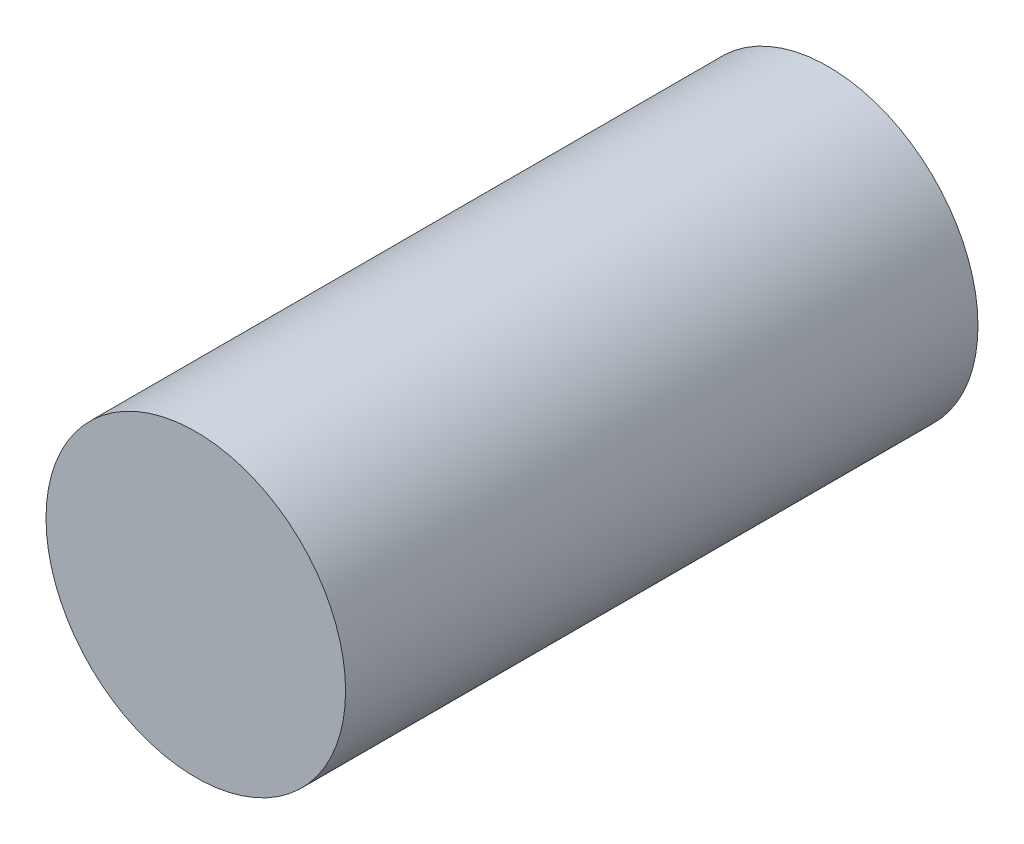
ISO-10303-21;
HEADER;
FILE_DESCRIPTION(('STEP AP214'),'2;1');
FILE_NAME('part.step','',(''),(''),'','','');
FILE_SCHEMA(('AUTOMOTIVE_DESIGN { 1 0 10303 214 1 1 1 1 }'));
ENDSEC;
DATA;
#1=APPLICATION_CONTEXT('core data for automotive mechanical design processes');
#2=APPLICATION_PROTOCOL_DEFINITION('international standard','automotive_design',2000,#1);
#3=PRODUCT_CONTEXT('',#1,'mechanical');
#4=PRODUCT('Part','Part','',(#3));
#5=PRODUCT_RELATED_PRODUCT_CATEGORY('part','',(#4));
#6=PRODUCT_DEFINITION_FORMATION('','',#4);
#7=PRODUCT_DEFINITION_CONTEXT('part definition',#1,'design');
#8=PRODUCT_DEFINITION('design','',#6,#7);
#9=PRODUCT_DEFINITION_SHAPE('','',#8);
#10=(LENGTH_UNIT() NAMED_UNIT(*) SI_UNIT(.MILLI.,.METRE.));
#11=(NAMED_UNIT(*) PLANE_ANGLE_UNIT() SI_UNIT($,.RADIAN.));
#12=(NAMED_UNIT(*) SI_UNIT($,.STERADIAN.) SOLID_ANGLE_UNIT());
#13=UNCERTAINTY_MEASURE_WITH_UNIT(LENGTH_MEASURE(1.E-05),#10,'distance_accuracy_value','');
#14=(GEOMETRIC_REPRESENTATION_CONTEXT(3) GLOBAL_UNCERTAINTY_ASSIGNED_CONTEXT((#13)) GLOBAL_UNIT_ASSIGNED_CONTEXT((#10,
#11,#12)) REPRESENTATION_CONTEXT('',''));
#15=CARTESIAN_POINT('',(0.,0.,0.));
#16=DIRECTION('',(0.,0.,1.));
#17=DIRECTION('',(1.,0.,0.));
#18=AXIS2_PLACEMENT_3D('',#15,#16,#17);
#19=CARTESIAN_POINT('',(0.,0.,19.));
#20=DIRECTION('',(0.,0.,-1.));
#21=DIRECTION('',(-1.,0.,0.));
#22=AXIS2_PLACEMENT_3D('',#19,#20,#21);
#23=CYLINDRICAL_SURFACE('',#22,4.5);
#24=CARTESIAN_POINT('',(0.,0.,19.));
#25=DIRECTION('',(0.,0.,1.));
#26=DIRECTION('',(1.,0.,0.));
#27=AXIS2_PLACEMENT_3D('',#24,#25,#26);
#28=CIRCLE('',#27,4.5);
#29=CARTESIAN_POINT('',(4.5,0.,19.));
#30=VERTEX_POINT('',#29);
#31=EDGE_CURVE('E10',#30,#30,#28,.T.);
#32=ORIENTED_EDGE('',*,*,#31,.F.);
#33=EDGE_LOOP('',(#32));
#34=FACE_BOUND('',#33,.T.);
#35=CARTESIAN_POINT('',(0.,0.,0.));
#36=DIRECTION('',(0.,0.,1.));
#37=DIRECTION('',(1.,0.,0.));
#38=AXIS2_PLACEMENT_3D('',#35,#36,#37);
#39=CIRCLE('',#38,4.5);
#40=CARTESIAN_POINT('',(4.5,0.,0.));
#41=VERTEX_POINT('',#40);
#42=EDGE_CURVE('E42',#41,#41,#39,.T.);
#43=ORIENTED_EDGE('',*,*,#42,.T.);
#44=EDGE_LOOP('',(#43));
#45=FACE_BOUND('',#44,.T.);
#46=ADVANCED_FACE('F39',(#34,#45),#23,.T.);
#47=CARTESIAN_POINT('',(0.,0.,19.));
#48=DIRECTION('',(0.,0.,1.));
#49=DIRECTION('',(1.,0.,0.));
#50=AXIS2_PLACEMENT_3D('',#47,#48,#49);
#51=PLANE('',#50);
#52=ORIENTED_EDGE('',*,*,#31,.T.);
#53=EDGE_LOOP('',(#52));
#54=FACE_BOUND('',#53,.T.);
#55=ADVANCED_FACE('F54',(#54),#51,.T.);
#56=CARTESIAN_POINT('',(0.,0.,0.));
#57=DIRECTION('',(0.,0.,1.));
#58=DIRECTION('',(1.,0.,0.));
#59=AXIS2_PLACEMENT_3D('',#56,#57,#58);
#60=PLANE('',#59);
#61=ORIENTED_EDGE('',*,*,#42,.F.);
#62=EDGE_LOOP('',(#61));
#63=FACE_BOUND('',#62,.T.);
#64=ADVANCED_FACE('F52',(#63),#60,.F.);
#65=CLOSED_SHELL('',(#46,#55,#64));
#66=MANIFOLD_SOLID_BREP('B2',#65);
#67=ADVANCED_BREP_SHAPE_REPRESENTATION('',(#18,#66),#14);
#68=SHAPE_DEFINITION_REPRESENTATION(#9,#67);
ENDSEC;
END-ISO-10303-21;
